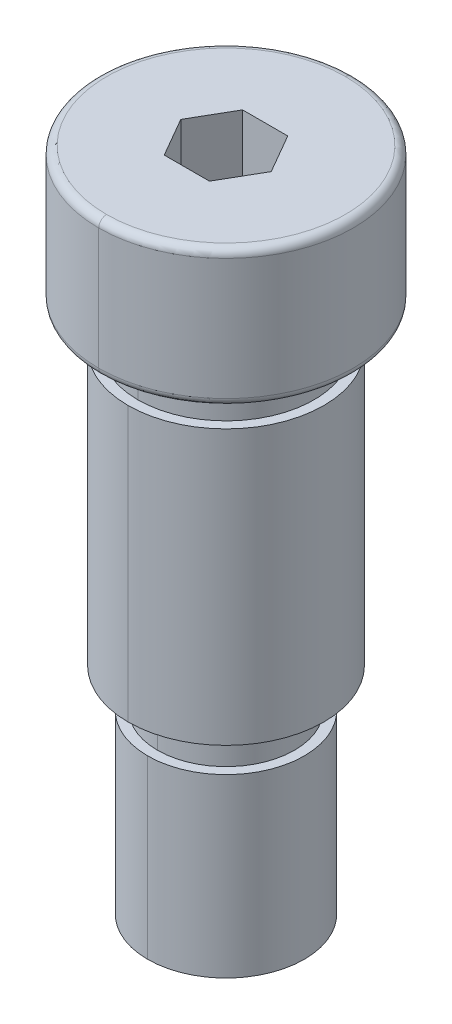
ISO-10303-21;
HEADER;
FILE_DESCRIPTION(('STEP AP214'),'2;1');
FILE_NAME('part.step','',(''),(''),'','','');
FILE_SCHEMA(('AUTOMOTIVE_DESIGN { 1 0 10303 214 1 1 1 1 }'));
ENDSEC;
DATA;
#1=APPLICATION_CONTEXT('core data for automotive mechanical design processes');
#2=APPLICATION_PROTOCOL_DEFINITION('international standard','automotive_design',2000,#1);
#3=PRODUCT_CONTEXT('',#1,'mechanical');
#4=PRODUCT('Part','Part','',(#3));
#5=PRODUCT_RELATED_PRODUCT_CATEGORY('part','',(#4));
#6=PRODUCT_DEFINITION_FORMATION('','',#4);
#7=PRODUCT_DEFINITION_CONTEXT('part definition',#1,'design');
#8=PRODUCT_DEFINITION('design','',#6,#7);
#9=PRODUCT_DEFINITION_SHAPE('','',#8);
#10=(LENGTH_UNIT() NAMED_UNIT(*) SI_UNIT(.MILLI.,.METRE.));
#11=(NAMED_UNIT(*) PLANE_ANGLE_UNIT() SI_UNIT($,.RADIAN.));
#12=(NAMED_UNIT(*) SI_UNIT($,.STERADIAN.) SOLID_ANGLE_UNIT());
#13=UNCERTAINTY_MEASURE_WITH_UNIT(LENGTH_MEASURE(1.E-05),#10,'distance_accuracy_value','');
#14=(GEOMETRIC_REPRESENTATION_CONTEXT(3) GLOBAL_UNCERTAINTY_ASSIGNED_CONTEXT((#13)) GLOBAL_UNIT_ASSIGNED_CONTEXT((#10,
#11,#12)) REPRESENTATION_CONTEXT('',''));
#15=CARTESIAN_POINT('',(0.,0.,0.));
#16=DIRECTION('',(0.,0.,1.));
#17=DIRECTION('',(1.,0.,0.));
#18=AXIS2_PLACEMENT_3D('',#15,#16,#17);
#19=CARTESIAN_POINT('',(0.,0.,0.));
#20=DIRECTION('',(0.,-1.,0.));
#21=DIRECTION('',(0.,0.,-1.));
#22=AXIS2_PLACEMENT_3D('',#19,#20,#21);
#23=CYLINDRICAL_SURFACE('',#22,4.);
#24=CARTESIAN_POINT('',(0.,9.,0.));
#25=DIRECTION('',(0.,-1.,0.));
#26=DIRECTION('',(0.,0.,-1.));
#27=AXIS2_PLACEMENT_3D('',#24,#25,#26);
#28=CIRCLE('',#27,4.);
#29=CARTESIAN_POINT('',(0.,9.,-4.));
#30=VERTEX_POINT('',#29);
#31=CARTESIAN_POINT('',(0.,9.,4.));
#32=VERTEX_POINT('',#31);
#33=EDGE_CURVE('E11',#30,#32,#28,.T.);
#34=ORIENTED_EDGE('',*,*,#33,.T.);
#35=DIRECTION('',(0.,-1.,0.));
#36=VECTOR('',#35,1.);
#37=CARTESIAN_POINT('',(0.,0.,4.));
#38=LINE('',#37,#36);
#39=CARTESIAN_POINT('',(0.,0.,4.));
#40=VERTEX_POINT('',#39);
#41=EDGE_CURVE('E28',#32,#40,#38,.T.);
#42=ORIENTED_EDGE('',*,*,#41,.T.);
#43=CARTESIAN_POINT('',(0.,0.,0.));
#44=DIRECTION('',(0.,-1.,0.));
#45=DIRECTION('',(0.,0.,-1.));
#46=AXIS2_PLACEMENT_3D('',#43,#44,#45);
#47=CIRCLE('',#46,4.);
#48=CARTESIAN_POINT('',(0.,0.,-4.));
#49=VERTEX_POINT('',#48);
#50=EDGE_CURVE('E242',#49,#40,#47,.T.);
#51=ORIENTED_EDGE('',*,*,#50,.F.);
#52=DIRECTION('',(0.,-1.,0.));
#53=VECTOR('',#52,1.);
#54=CARTESIAN_POINT('',(0.,0.,-4.));
#55=LINE('',#54,#53);
#56=EDGE_CURVE('E315',#30,#49,#55,.T.);
#57=ORIENTED_EDGE('',*,*,#56,.F.);
#58=EDGE_LOOP('',(#34,#42,#51,#57));
#59=FACE_BOUND('',#58,.T.);
#60=ADVANCED_FACE('F17',(#59),#23,.T.);
#61=CARTESIAN_POINT('',(0.,0.,0.));
#62=DIRECTION('',(0.,-1.,0.));
#63=DIRECTION('',(0.,0.,-1.));
#64=AXIS2_PLACEMENT_3D('',#61,#62,#63);
#65=CYLINDRICAL_SURFACE('',#64,3.5);
#66=CARTESIAN_POINT('',(0.,11.,0.));
#67=DIRECTION('',(0.,-1.,0.));
#68=DIRECTION('',(0.,0.,-1.));
#69=AXIS2_PLACEMENT_3D('',#66,#67,#68);
#70=CIRCLE('',#69,3.5);
#71=CARTESIAN_POINT('',(0.,11.,-3.5));
#72=VERTEX_POINT('',#71);
#73=CARTESIAN_POINT('',(0.,11.,3.5));
#74=VERTEX_POINT('',#73);
#75=EDGE_CURVE('E178',#72,#74,#70,.T.);
#76=ORIENTED_EDGE('',*,*,#75,.T.);
#77=DIRECTION('',(0.,-1.,0.));
#78=VECTOR('',#77,1.);
#79=CARTESIAN_POINT('',(0.,0.,3.5));
#80=LINE('',#79,#78);
#81=CARTESIAN_POINT('',(0.,9.,3.5));
#82=VERTEX_POINT('',#81);
#83=EDGE_CURVE('E167',#74,#82,#80,.T.);
#84=ORIENTED_EDGE('',*,*,#83,.T.);
#85=CARTESIAN_POINT('',(0.,9.,0.));
#86=DIRECTION('',(0.,-1.,0.));
#87=DIRECTION('',(0.,0.,-1.));
#88=AXIS2_PLACEMENT_3D('',#85,#86,#87);
#89=CIRCLE('',#88,3.5);
#90=CARTESIAN_POINT('',(0.,9.,-3.5));
#91=VERTEX_POINT('',#90);
#92=EDGE_CURVE('E201',#91,#82,#89,.T.);
#93=ORIENTED_EDGE('',*,*,#92,.F.);
#94=DIRECTION('',(0.,-1.,0.));
#95=VECTOR('',#94,1.);
#96=CARTESIAN_POINT('',(0.,0.,-3.5));
#97=LINE('',#96,#95);
#98=EDGE_CURVE('E184',#72,#91,#97,.T.);
#99=ORIENTED_EDGE('',*,*,#98,.F.);
#100=EDGE_LOOP('',(#76,#84,#93,#99));
#101=FACE_BOUND('',#100,.T.);
#102=ADVANCED_FACE('F183',(#101),#65,.T.);
#103=CARTESIAN_POINT('',(0.,0.,0.));
#104=DIRECTION('',(0.,-1.,0.));
#105=DIRECTION('',(0.,0.,-1.));
#106=AXIS2_PLACEMENT_3D('',#103,#104,#105);
#107=CYLINDRICAL_SURFACE('',#106,5.);
#108=CARTESIAN_POINT('',(0.,25.,0.));
#109=DIRECTION('',(0.,-1.,0.));
#110=DIRECTION('',(0.,0.,-1.));
#111=AXIS2_PLACEMENT_3D('',#108,#109,#110);
#112=CIRCLE('',#111,5.);
#113=CARTESIAN_POINT('',(0.,25.,-5.));
#114=VERTEX_POINT('',#113);
#115=CARTESIAN_POINT('',(0.,25.,5.));
#116=VERTEX_POINT('',#115);
#117=EDGE_CURVE('E179',#114,#116,#112,.T.);
#118=ORIENTED_EDGE('',*,*,#117,.T.);
#119=DIRECTION('',(0.,-1.,0.));
#120=VECTOR('',#119,1.);
#121=CARTESIAN_POINT('',(0.,0.,5.));
#122=LINE('',#121,#120);
#123=CARTESIAN_POINT('',(0.,11.,5.));
#124=VERTEX_POINT('',#123);
#125=EDGE_CURVE('E248',#116,#124,#122,.T.);
#126=ORIENTED_EDGE('',*,*,#125,.T.);
#127=CARTESIAN_POINT('',(0.,11.,0.));
#128=DIRECTION('',(0.,-1.,0.));
#129=DIRECTION('',(0.,0.,-1.));
#130=AXIS2_PLACEMENT_3D('',#127,#128,#129);
#131=CIRCLE('',#130,5.);
#132=CARTESIAN_POINT('',(0.,11.,-5.));
#133=VERTEX_POINT('',#132);
#134=EDGE_CURVE('E198',#133,#124,#131,.T.);
#135=ORIENTED_EDGE('',*,*,#134,.F.);
#136=DIRECTION('',(0.,-1.,0.));
#137=VECTOR('',#136,1.);
#138=CARTESIAN_POINT('',(0.,0.,-5.));
#139=LINE('',#138,#137);
#140=EDGE_CURVE('E220',#114,#133,#139,.T.);
#141=ORIENTED_EDGE('',*,*,#140,.F.);
#142=EDGE_LOOP('',(#118,#126,#135,#141));
#143=FACE_BOUND('',#142,.T.);
#144=ADVANCED_FACE('F482',(#143),#107,.T.);
#145=CARTESIAN_POINT('',(0.,0.,0.));
#146=DIRECTION('',(0.,-1.,0.));
#147=DIRECTION('',(0.,0.,-1.));
#148=AXIS2_PLACEMENT_3D('',#145,#146,#147);
#149=CYLINDRICAL_SURFACE('',#148,4.5);
#150=CARTESIAN_POINT('',(0.,27.,0.));
#151=DIRECTION('',(0.,-1.,0.));
#152=DIRECTION('',(0.,0.,-1.));
#153=AXIS2_PLACEMENT_3D('',#150,#151,#152);
#154=CIRCLE('',#153,4.5);
#155=CARTESIAN_POINT('',(0.,27.,-4.5));
#156=VERTEX_POINT('',#155);
#157=CARTESIAN_POINT('',(0.,27.,4.5));
#158=VERTEX_POINT('',#157);
#159=EDGE_CURVE('E205',#156,#158,#154,.T.);
#160=ORIENTED_EDGE('',*,*,#159,.T.);
#161=DIRECTION('',(0.,-1.,0.));
#162=VECTOR('',#161,1.);
#163=CARTESIAN_POINT('',(0.,0.,4.5));
#164=LINE('',#163,#162);
#165=CARTESIAN_POINT('',(0.,25.,4.5));
#166=VERTEX_POINT('',#165);
#167=EDGE_CURVE('E207',#158,#166,#164,.T.);
#168=ORIENTED_EDGE('',*,*,#167,.T.);
#169=CARTESIAN_POINT('',(0.,25.,0.));
#170=DIRECTION('',(0.,-1.,0.));
#171=DIRECTION('',(0.,0.,-1.));
#172=AXIS2_PLACEMENT_3D('',#169,#170,#171);
#173=CIRCLE('',#172,4.5);
#174=CARTESIAN_POINT('',(0.,25.,-4.5));
#175=VERTEX_POINT('',#174);
#176=EDGE_CURVE('E265',#175,#166,#173,.T.);
#177=ORIENTED_EDGE('',*,*,#176,.F.);
#178=DIRECTION('',(0.,-1.,0.));
#179=VECTOR('',#178,1.);
#180=CARTESIAN_POINT('',(0.,0.,-4.5));
#181=LINE('',#180,#179);
#182=EDGE_CURVE('E267',#156,#175,#181,.T.);
#183=ORIENTED_EDGE('',*,*,#182,.F.);
#184=EDGE_LOOP('',(#160,#168,#177,#183));
#185=FACE_BOUND('',#184,.T.);
#186=ADVANCED_FACE('F457',(#185),#149,.T.);
#187=CARTESIAN_POINT('',(0.,27.4,0.));
#188=DIRECTION('',(0.,-1.,0.));
#189=DIRECTION('',(0.,0.,-1.));
#190=AXIS2_PLACEMENT_3D('',#187,#188,#189);
#191=TOROIDAL_SURFACE('',#190,6.1,0.4);
#192=CARTESIAN_POINT('',(0.,27.4,0.));
#193=DIRECTION('',(0.,-1.,0.));
#194=DIRECTION('',(0.,0.,-1.));
#195=AXIS2_PLACEMENT_3D('',#192,#193,#194);
#196=CIRCLE('',#195,6.5);
#197=CARTESIAN_POINT('',(0.,27.4,-6.5));
#198=VERTEX_POINT('',#197);
#199=CARTESIAN_POINT('',(0.,27.4,6.5));
#200=VERTEX_POINT('',#199);
#201=EDGE_CURVE('E210',#198,#200,#196,.T.);
#202=ORIENTED_EDGE('',*,*,#201,.T.);
#203=CARTESIAN_POINT('',(0.,27.4,6.1));
#204=DIRECTION('',(1.,0.,0.));
#205=DIRECTION('',(0.,0.,-1.));
#206=AXIS2_PLACEMENT_3D('',#203,#204,#205);
#207=CIRCLE('',#206,0.4);
#208=CARTESIAN_POINT('',(0.,27.,6.1));
#209=VERTEX_POINT('',#208);
#210=EDGE_CURVE('E255',#200,#209,#207,.T.);
#211=ORIENTED_EDGE('',*,*,#210,.T.);
#212=CARTESIAN_POINT('',(0.,27.,0.));
#213=DIRECTION('',(0.,-1.,0.));
#214=DIRECTION('',(0.,0.,-1.));
#215=AXIS2_PLACEMENT_3D('',#212,#213,#214);
#216=CIRCLE('',#215,6.1);
#217=CARTESIAN_POINT('',(0.,27.,-6.1));
#218=VERTEX_POINT('',#217);
#219=EDGE_CURVE('E310',#218,#209,#216,.T.);
#220=ORIENTED_EDGE('',*,*,#219,.F.);
#221=CARTESIAN_POINT('',(0.,27.4,-6.1));
#222=DIRECTION('',(-1.,0.,0.));
#223=DIRECTION('',(0.,0.,1.));
#224=AXIS2_PLACEMENT_3D('',#221,#222,#223);
#225=CIRCLE('',#224,0.4);
#226=EDGE_CURVE('E262',#198,#218,#225,.T.);
#227=ORIENTED_EDGE('',*,*,#226,.F.);
#228=EDGE_LOOP('',(#202,#211,#220,#227));
#229=FACE_BOUND('',#228,.T.);
#230=ADVANCED_FACE('F585',(#229),#191,.T.);
#231=CARTESIAN_POINT('',(0.,0.,0.));
#232=DIRECTION('',(0.,-1.,0.));
#233=DIRECTION('',(0.,0.,-1.));
#234=AXIS2_PLACEMENT_3D('',#231,#232,#233);
#235=CYLINDRICAL_SURFACE('',#234,6.5);
#236=CARTESIAN_POINT('',(0.,33.6,0.));
#237=DIRECTION('',(0.,-1.,0.));
#238=DIRECTION('',(0.,0.,-1.));
#239=AXIS2_PLACEMENT_3D('',#236,#237,#238);
#240=CIRCLE('',#239,6.5);
#241=CARTESIAN_POINT('',(0.,33.6,-6.5));
#242=VERTEX_POINT('',#241);
#243=CARTESIAN_POINT('',(0.,33.6,6.5));
#244=VERTEX_POINT('',#243);
#245=EDGE_CURVE('E251',#242,#244,#240,.T.);
#246=ORIENTED_EDGE('',*,*,#245,.T.);
#247=DIRECTION('',(0.,-1.,0.));
#248=VECTOR('',#247,1.);
#249=CARTESIAN_POINT('',(0.,0.,6.5));
#250=LINE('',#249,#248);
#251=EDGE_CURVE('E256',#244,#200,#250,.T.);
#252=ORIENTED_EDGE('',*,*,#251,.T.);
#253=ORIENTED_EDGE('',*,*,#201,.F.);
#254=DIRECTION('',(0.,-1.,0.));
#255=VECTOR('',#254,1.);
#256=CARTESIAN_POINT('',(0.,0.,-6.5));
#257=LINE('',#256,#255);
#258=EDGE_CURVE('E261',#242,#198,#257,.T.);
#259=ORIENTED_EDGE('',*,*,#258,.F.);
#260=EDGE_LOOP('',(#246,#252,#253,#259));
#261=FACE_BOUND('',#260,.T.);
#262=ADVANCED_FACE('F486',(#261),#235,.T.);
#263=CARTESIAN_POINT('',(0.,33.6,0.));
#264=DIRECTION('',(0.,-1.,0.));
#265=DIRECTION('',(0.,0.,-1.));
#266=AXIS2_PLACEMENT_3D('',#263,#264,#265);
#267=TOROIDAL_SURFACE('',#266,6.1,0.4);
#268=CARTESIAN_POINT('',(0.,34.,0.));
#269=DIRECTION('',(0.,-1.,0.));
#270=DIRECTION('',(0.,0.,-1.));
#271=AXIS2_PLACEMENT_3D('',#268,#269,#270);
#272=CIRCLE('',#271,6.1);
#273=CARTESIAN_POINT('',(0.,34.,-6.1));
#274=VERTEX_POINT('',#273);
#275=CARTESIAN_POINT('',(0.,34.,6.1));
#276=VERTEX_POINT('',#275);
#277=EDGE_CURVE('E277',#274,#276,#272,.T.);
#278=ORIENTED_EDGE('',*,*,#277,.T.);
#279=CARTESIAN_POINT('',(0.,33.6,6.1));
#280=DIRECTION('',(1.,0.,0.));
#281=DIRECTION('',(0.,0.,-1.));
#282=AXIS2_PLACEMENT_3D('',#279,#280,#281);
#283=CIRCLE('',#282,0.4);
#284=EDGE_CURVE('E218',#276,#244,#283,.T.);
#285=ORIENTED_EDGE('',*,*,#284,.T.);
#286=ORIENTED_EDGE('',*,*,#245,.F.);
#287=CARTESIAN_POINT('',(0.,33.6,-6.1));
#288=DIRECTION('',(-1.,0.,0.));
#289=DIRECTION('',(0.,0.,1.));
#290=AXIS2_PLACEMENT_3D('',#287,#288,#289);
#291=CIRCLE('',#290,0.4);
#292=EDGE_CURVE('E219',#274,#242,#291,.T.);
#293=ORIENTED_EDGE('',*,*,#292,.F.);
#294=EDGE_LOOP('',(#278,#285,#286,#293));
#295=FACE_BOUND('',#294,.T.);
#296=ADVANCED_FACE('F639',(#295),#267,.T.);
#297=CARTESIAN_POINT('',(0.,34.,0.));
#298=DIRECTION('',(0.,-1.,0.));
#299=DIRECTION('',(0.,0.,-1.));
#300=AXIS2_PLACEMENT_3D('',#297,#298,#299);
#301=PLANE('',#300);
#302=ORIENTED_EDGE('',*,*,#277,.F.);
#303=CARTESIAN_POINT('',(0.,34.,0.));
#304=DIRECTION('',(0.,-1.,0.));
#305=DIRECTION('',(0.,0.,-1.));
#306=AXIS2_PLACEMENT_3D('',#303,#304,#305);
#307=CIRCLE('',#306,6.1);
#308=EDGE_CURVE('E215',#276,#274,#307,.T.);
#309=ORIENTED_EDGE('',*,*,#308,.F.);
#310=EDGE_LOOP('',(#302,#309));
#311=FACE_BOUND('',#310,.T.);
#312=DIRECTION('',(-1.,0.,0.));
#313=VECTOR('',#312,1.);
#314=CARTESIAN_POINT('',(1.15470053837925,34.,-2.));
#315=LINE('',#314,#313);
#316=CARTESIAN_POINT('',(1.15470053837925,34.,-2.));
#317=VERTEX_POINT('',#316);
#318=CARTESIAN_POINT('',(-1.15470053837925,34.,-2.));
#319=VERTEX_POINT('',#318);
#320=EDGE_CURVE('E332',#317,#319,#315,.T.);
#321=ORIENTED_EDGE('',*,*,#320,.F.);
#322=DIRECTION('',(-0.5,0.,-0.866025403784439));
#323=VECTOR('',#322,1.);
#324=CARTESIAN_POINT('',(2.30940107675851,34.,0.));
#325=LINE('',#324,#323);
#326=CARTESIAN_POINT('',(2.30940107675851,34.,0.));
#327=VERTEX_POINT('',#326);
#328=EDGE_CURVE('E269',#327,#317,#325,.T.);
#329=ORIENTED_EDGE('',*,*,#328,.F.);
#330=DIRECTION('',(0.5,0.,-0.866025403784439));
#331=VECTOR('',#330,1.);
#332=CARTESIAN_POINT('',(1.15470053837925,34.,2.));
#333=LINE('',#332,#331);
#334=CARTESIAN_POINT('',(1.15470053837925,34.,2.));
#335=VERTEX_POINT('',#334);
#336=EDGE_CURVE('E71',#335,#327,#333,.T.);
#337=ORIENTED_EDGE('',*,*,#336,.F.);
#338=DIRECTION('',(1.,0.,0.));
#339=VECTOR('',#338,1.);
#340=CARTESIAN_POINT('',(-1.15470053837925,34.,2.));
#341=LINE('',#340,#339);
#342=CARTESIAN_POINT('',(-1.15470053837925,34.,2.));
#343=VERTEX_POINT('',#342);
#344=EDGE_CURVE('E87',#343,#335,#341,.T.);
#345=ORIENTED_EDGE('',*,*,#344,.F.);
#346=DIRECTION('',(0.5,0.,0.866025403784439));
#347=VECTOR('',#346,1.);
#348=CARTESIAN_POINT('',(-2.30940107675851,34.,0.));
#349=LINE('',#348,#347);
#350=CARTESIAN_POINT('',(-2.30940107675851,34.,0.));
#351=VERTEX_POINT('',#350);
#352=EDGE_CURVE('E385',#351,#343,#349,.T.);
#353=ORIENTED_EDGE('',*,*,#352,.F.);
#354=DIRECTION('',(-0.5,0.,0.866025403784439));
#355=VECTOR('',#354,1.);
#356=CARTESIAN_POINT('',(-1.15470053837925,34.,-2.));
#357=LINE('',#356,#355);
#358=EDGE_CURVE('E378',#319,#351,#357,.T.);
#359=ORIENTED_EDGE('',*,*,#358,.F.);
#360=EDGE_LOOP('',(#321,#329,#337,#345,#353,#359));
#361=FACE_BOUND('',#360,.T.);
#362=ADVANCED_FACE('F417',(#311,#361),#301,.F.);
#363=CARTESIAN_POINT('',(0.,33.6,0.));
#364=DIRECTION('',(0.,-1.,0.));
#365=DIRECTION('',(0.,0.,-1.));
#366=AXIS2_PLACEMENT_3D('',#363,#364,#365);
#367=TOROIDAL_SURFACE('',#366,6.1,0.4);
#368=ORIENTED_EDGE('',*,*,#284,.F.);
#369=ORIENTED_EDGE('',*,*,#308,.T.);
#370=ORIENTED_EDGE('',*,*,#292,.T.);
#371=CARTESIAN_POINT('',(0.,33.6,0.));
#372=DIRECTION('',(0.,-1.,0.));
#373=DIRECTION('',(0.,0.,-1.));
#374=AXIS2_PLACEMENT_3D('',#371,#372,#373);
#375=CIRCLE('',#374,6.5);
#376=EDGE_CURVE('E356',#244,#242,#375,.T.);
#377=ORIENTED_EDGE('',*,*,#376,.F.);
#378=EDGE_LOOP('',(#368,#369,#370,#377));
#379=FACE_BOUND('',#378,.T.);
#380=ADVANCED_FACE('F493',(#379),#367,.T.);
#381=CARTESIAN_POINT('',(0.,0.,0.));
#382=DIRECTION('',(0.,-1.,0.));
#383=DIRECTION('',(0.,0.,-1.));
#384=AXIS2_PLACEMENT_3D('',#381,#382,#383);
#385=CYLINDRICAL_SURFACE('',#384,6.5);
#386=ORIENTED_EDGE('',*,*,#251,.F.);
#387=ORIENTED_EDGE('',*,*,#376,.T.);
#388=ORIENTED_EDGE('',*,*,#258,.T.);
#389=CARTESIAN_POINT('',(0.,27.4,0.));
#390=DIRECTION('',(0.,-1.,0.));
#391=DIRECTION('',(0.,0.,-1.));
#392=AXIS2_PLACEMENT_3D('',#389,#390,#391);
#393=CIRCLE('',#392,6.5);
#394=EDGE_CURVE('E257',#200,#198,#393,.T.);
#395=ORIENTED_EDGE('',*,*,#394,.F.);
#396=EDGE_LOOP('',(#386,#387,#388,#395));
#397=FACE_BOUND('',#396,.T.);
#398=ADVANCED_FACE('F471',(#397),#385,.T.);
#399=CARTESIAN_POINT('',(0.,27.4,0.));
#400=DIRECTION('',(0.,-1.,0.));
#401=DIRECTION('',(0.,0.,-1.));
#402=AXIS2_PLACEMENT_3D('',#399,#400,#401);
#403=TOROIDAL_SURFACE('',#402,6.1,0.4);
#404=ORIENTED_EDGE('',*,*,#210,.F.);
#405=ORIENTED_EDGE('',*,*,#394,.T.);
#406=ORIENTED_EDGE('',*,*,#226,.T.);
#407=CARTESIAN_POINT('',(0.,27.,0.));
#408=DIRECTION('',(0.,-1.,0.));
#409=DIRECTION('',(0.,0.,-1.));
#410=AXIS2_PLACEMENT_3D('',#407,#408,#409);
#411=CIRCLE('',#410,6.1);
#412=EDGE_CURVE('E287',#209,#218,#411,.T.);
#413=ORIENTED_EDGE('',*,*,#412,.F.);
#414=EDGE_LOOP('',(#404,#405,#406,#413));
#415=FACE_BOUND('',#414,.T.);
#416=ADVANCED_FACE('F461',(#415),#403,.T.);
#417=CARTESIAN_POINT('',(-6.1,27.,0.));
#418=DIRECTION('',(0.,1.,0.));
#419=DIRECTION('',(1.,0.,0.));
#420=AXIS2_PLACEMENT_3D('',#417,#418,#419);
#421=PLANE('',#420);
#422=ORIENTED_EDGE('',*,*,#219,.T.);
#423=ORIENTED_EDGE('',*,*,#412,.T.);
#424=EDGE_LOOP('',(#422,#423));
#425=FACE_BOUND('',#424,.T.);
#426=ORIENTED_EDGE('',*,*,#159,.F.);
#427=CARTESIAN_POINT('',(0.,27.,0.));
#428=DIRECTION('',(0.,-1.,0.));
#429=DIRECTION('',(0.,0.,-1.));
#430=AXIS2_PLACEMENT_3D('',#427,#428,#429);
#431=CIRCLE('',#430,4.5);
#432=EDGE_CURVE('E284',#158,#156,#431,.T.);
#433=ORIENTED_EDGE('',*,*,#432,.F.);
#434=EDGE_LOOP('',(#426,#433));
#435=FACE_BOUND('',#434,.T.);
#436=ADVANCED_FACE('F459',(#425,#435),#421,.F.);
#437=CARTESIAN_POINT('',(0.,0.,0.));
#438=DIRECTION('',(0.,-1.,0.));
#439=DIRECTION('',(0.,0.,-1.));
#440=AXIS2_PLACEMENT_3D('',#437,#438,#439);
#441=CYLINDRICAL_SURFACE('',#440,4.5);
#442=ORIENTED_EDGE('',*,*,#167,.F.);
#443=ORIENTED_EDGE('',*,*,#432,.T.);
#444=ORIENTED_EDGE('',*,*,#182,.T.);
#445=CARTESIAN_POINT('',(0.,25.,0.));
#446=DIRECTION('',(0.,-1.,0.));
#447=DIRECTION('',(0.,0.,-1.));
#448=AXIS2_PLACEMENT_3D('',#445,#446,#447);
#449=CIRCLE('',#448,4.5);
#450=EDGE_CURVE('E232',#166,#175,#449,.T.);
#451=ORIENTED_EDGE('',*,*,#450,.F.);
#452=EDGE_LOOP('',(#442,#443,#444,#451));
#453=FACE_BOUND('',#452,.T.);
#454=ADVANCED_FACE('F453',(#453),#441,.T.);
#455=CARTESIAN_POINT('',(-4.5,25.,0.));
#456=DIRECTION('',(0.,-1.,0.));
#457=DIRECTION('',(0.,0.,-1.));
#458=AXIS2_PLACEMENT_3D('',#455,#456,#457);
#459=PLANE('',#458);
#460=ORIENTED_EDGE('',*,*,#117,.F.);
#461=CARTESIAN_POINT('',(0.,25.,0.));
#462=DIRECTION('',(0.,-1.,0.));
#463=DIRECTION('',(0.,0.,-1.));
#464=AXIS2_PLACEMENT_3D('',#461,#462,#463);
#465=CIRCLE('',#464,5.);
#466=EDGE_CURVE('E223',#116,#114,#465,.T.);
#467=ORIENTED_EDGE('',*,*,#466,.F.);
#468=EDGE_LOOP('',(#460,#467));
#469=FACE_BOUND('',#468,.T.);
#470=ORIENTED_EDGE('',*,*,#176,.T.);
#471=ORIENTED_EDGE('',*,*,#450,.T.);
#472=EDGE_LOOP('',(#470,#471));
#473=FACE_BOUND('',#472,.T.);
#474=ADVANCED_FACE('F469',(#469,#473),#459,.F.);
#475=CARTESIAN_POINT('',(0.,0.,0.));
#476=DIRECTION('',(0.,-1.,0.));
#477=DIRECTION('',(0.,0.,-1.));
#478=AXIS2_PLACEMENT_3D('',#475,#476,#477);
#479=CYLINDRICAL_SURFACE('',#478,5.);
#480=ORIENTED_EDGE('',*,*,#125,.F.);
#481=ORIENTED_EDGE('',*,*,#466,.T.);
#482=ORIENTED_EDGE('',*,*,#140,.T.);
#483=CARTESIAN_POINT('',(0.,11.,0.));
#484=DIRECTION('',(0.,-1.,0.));
#485=DIRECTION('',(0.,0.,-1.));
#486=AXIS2_PLACEMENT_3D('',#483,#484,#485);
#487=CIRCLE('',#486,5.);
#488=EDGE_CURVE('E190',#124,#133,#487,.T.);
#489=ORIENTED_EDGE('',*,*,#488,.F.);
#490=EDGE_LOOP('',(#480,#481,#482,#489));
#491=FACE_BOUND('',#490,.T.);
#492=ADVANCED_FACE('F602',(#491),#479,.T.);
#493=CARTESIAN_POINT('',(-5.,11.,0.));
#494=DIRECTION('',(0.,1.,0.));
#495=DIRECTION('',(1.,0.,0.));
#496=AXIS2_PLACEMENT_3D('',#493,#494,#495);
#497=PLANE('',#496);
#498=ORIENTED_EDGE('',*,*,#134,.T.);
#499=ORIENTED_EDGE('',*,*,#488,.T.);
#500=EDGE_LOOP('',(#498,#499));
#501=FACE_BOUND('',#500,.T.);
#502=ORIENTED_EDGE('',*,*,#75,.F.);
#503=CARTESIAN_POINT('',(0.,11.,0.));
#504=DIRECTION('',(0.,-1.,0.));
#505=DIRECTION('',(0.,0.,-1.));
#506=AXIS2_PLACEMENT_3D('',#503,#504,#505);
#507=CIRCLE('',#506,3.5);
#508=EDGE_CURVE('E172',#74,#72,#507,.T.);
#509=ORIENTED_EDGE('',*,*,#508,.F.);
#510=EDGE_LOOP('',(#502,#509));
#511=FACE_BOUND('',#510,.T.);
#512=ADVANCED_FACE('F188',(#501,#511),#497,.F.);
#513=CARTESIAN_POINT('',(0.,0.,0.));
#514=DIRECTION('',(0.,-1.,0.));
#515=DIRECTION('',(0.,0.,-1.));
#516=AXIS2_PLACEMENT_3D('',#513,#514,#515);
#517=CYLINDRICAL_SURFACE('',#516,3.5);
#518=ORIENTED_EDGE('',*,*,#83,.F.);
#519=ORIENTED_EDGE('',*,*,#508,.T.);
#520=ORIENTED_EDGE('',*,*,#98,.T.);
#521=CARTESIAN_POINT('',(0.,9.,0.));
#522=DIRECTION('',(0.,-1.,0.));
#523=DIRECTION('',(0.,0.,-1.));
#524=AXIS2_PLACEMENT_3D('',#521,#522,#523);
#525=CIRCLE('',#524,3.5);
#526=EDGE_CURVE('E174',#82,#91,#525,.T.);
#527=ORIENTED_EDGE('',*,*,#526,.F.);
#528=EDGE_LOOP('',(#518,#519,#520,#527));
#529=FACE_BOUND('',#528,.T.);
#530=ADVANCED_FACE('F169',(#529),#517,.T.);
#531=CARTESIAN_POINT('',(-3.5,9.,0.));
#532=DIRECTION('',(0.,-1.,0.));
#533=DIRECTION('',(0.,0.,-1.));
#534=AXIS2_PLACEMENT_3D('',#531,#532,#533);
#535=PLANE('',#534);
#536=ORIENTED_EDGE('',*,*,#33,.F.);
#537=CARTESIAN_POINT('',(0.,9.,0.));
#538=DIRECTION('',(0.,-1.,0.));
#539=DIRECTION('',(0.,0.,-1.));
#540=AXIS2_PLACEMENT_3D('',#537,#538,#539);
#541=CIRCLE('',#540,4.);
#542=EDGE_CURVE('E312',#32,#30,#541,.T.);
#543=ORIENTED_EDGE('',*,*,#542,.F.);
#544=EDGE_LOOP('',(#536,#543));
#545=FACE_BOUND('',#544,.T.);
#546=ORIENTED_EDGE('',*,*,#92,.T.);
#547=ORIENTED_EDGE('',*,*,#526,.T.);
#548=EDGE_LOOP('',(#546,#547));
#549=FACE_BOUND('',#548,.T.);
#550=ADVANCED_FACE('F500',(#545,#549),#535,.F.);
#551=CARTESIAN_POINT('',(0.,0.,0.));
#552=DIRECTION('',(0.,-1.,0.));
#553=DIRECTION('',(0.,0.,-1.));
#554=AXIS2_PLACEMENT_3D('',#551,#552,#553);
#555=CYLINDRICAL_SURFACE('',#554,4.);
#556=ORIENTED_EDGE('',*,*,#41,.F.);
#557=ORIENTED_EDGE('',*,*,#542,.T.);
#558=ORIENTED_EDGE('',*,*,#56,.T.);
#559=CARTESIAN_POINT('',(0.,0.,0.));
#560=DIRECTION('',(0.,-1.,0.));
#561=DIRECTION('',(0.,0.,-1.));
#562=AXIS2_PLACEMENT_3D('',#559,#560,#561);
#563=CIRCLE('',#562,4.);
#564=EDGE_CURVE('E272',#40,#49,#563,.T.);
#565=ORIENTED_EDGE('',*,*,#564,.F.);
#566=EDGE_LOOP('',(#556,#557,#558,#565));
#567=FACE_BOUND('',#566,.T.);
#568=ADVANCED_FACE('F19',(#567),#555,.T.);
#569=CARTESIAN_POINT('',(-4.,0.,0.));
#570=DIRECTION('',(0.,1.,0.));
#571=DIRECTION('',(1.,0.,0.));
#572=AXIS2_PLACEMENT_3D('',#569,#570,#571);
#573=PLANE('',#572);
#574=ORIENTED_EDGE('',*,*,#50,.T.);
#575=ORIENTED_EDGE('',*,*,#564,.T.);
#576=EDGE_LOOP('',(#574,#575));
#577=FACE_BOUND('',#576,.T.);
#578=ADVANCED_FACE('F507',(#577),#573,.F.);
#579=CARTESIAN_POINT('',(2.30940107675851,30.5,0.));
#580=DIRECTION('',(0.866025403784439,0.,-0.5));
#581=DIRECTION('',(0.,-1.,0.));
#582=AXIS2_PLACEMENT_3D('',#579,#580,#581);
#583=PLANE('',#582);
#584=ORIENTED_EDGE('',*,*,#328,.T.);
#585=DIRECTION('',(0.,1.,0.));
#586=VECTOR('',#585,1.);
#587=CARTESIAN_POINT('',(1.15470053837925,30.5,-2.));
#588=LINE('',#587,#586);
#589=CARTESIAN_POINT('',(1.15470053837925,30.5,-2.));
#590=VERTEX_POINT('',#589);
#591=EDGE_CURVE('E282',#590,#317,#588,.T.);
#592=ORIENTED_EDGE('',*,*,#591,.F.);
#593=DIRECTION('',(-0.5,0.,-0.866025403784439));
#594=VECTOR('',#593,1.);
#595=CARTESIAN_POINT('',(2.30940107675851,30.5,0.));
#596=LINE('',#595,#594);
#597=CARTESIAN_POINT('',(2.30940107675851,30.5,0.));
#598=VERTEX_POINT('',#597);
#599=EDGE_CURVE('E278',#598,#590,#596,.T.);
#600=ORIENTED_EDGE('',*,*,#599,.F.);
#601=DIRECTION('',(0.,1.,0.));
#602=VECTOR('',#601,1.);
#603=CARTESIAN_POINT('',(2.30940107675851,30.5,0.));
#604=LINE('',#603,#602);
#605=EDGE_CURVE('E273',#598,#327,#604,.T.);
#606=ORIENTED_EDGE('',*,*,#605,.T.);
#607=EDGE_LOOP('',(#584,#592,#600,#606));
#608=FACE_BOUND('',#607,.T.);
#609=ADVANCED_FACE('F420',(#608),#583,.F.);
#610=CARTESIAN_POINT('',(1.15470053837925,30.5,2.));
#611=DIRECTION('',(0.866025403784439,0.,0.5));
#612=DIRECTION('',(0.,-1.,0.));
#613=AXIS2_PLACEMENT_3D('',#610,#611,#612);
#614=PLANE('',#613);
#615=ORIENTED_EDGE('',*,*,#336,.T.);
#616=ORIENTED_EDGE('',*,*,#605,.F.);
#617=DIRECTION('',(0.5,0.,-0.866025403784439));
#618=VECTOR('',#617,1.);
#619=CARTESIAN_POINT('',(1.15470053837925,30.5,2.));
#620=LINE('',#619,#618);
#621=CARTESIAN_POINT('',(1.15470053837925,30.5,2.));
#622=VERTEX_POINT('',#621);
#623=EDGE_CURVE('E211',#622,#598,#620,.T.);
#624=ORIENTED_EDGE('',*,*,#623,.F.);
#625=DIRECTION('',(0.,1.,0.));
#626=VECTOR('',#625,1.);
#627=CARTESIAN_POINT('',(1.15470053837925,30.5,2.));
#628=LINE('',#627,#626);
#629=EDGE_CURVE('E352',#622,#335,#628,.T.);
#630=ORIENTED_EDGE('',*,*,#629,.T.);
#631=EDGE_LOOP('',(#615,#616,#624,#630));
#632=FACE_BOUND('',#631,.T.);
#633=ADVANCED_FACE('F418',(#632),#614,.F.);
#634=CARTESIAN_POINT('',(-1.15470053837925,30.5,2.));
#635=DIRECTION('',(0.,0.,1.));
#636=DIRECTION('',(1.,0.,0.));
#637=AXIS2_PLACEMENT_3D('',#634,#635,#636);
#638=PLANE('',#637);
#639=ORIENTED_EDGE('',*,*,#344,.T.);
#640=ORIENTED_EDGE('',*,*,#629,.F.);
#641=DIRECTION('',(1.,0.,0.));
#642=VECTOR('',#641,1.);
#643=CARTESIAN_POINT('',(-1.15470053837925,30.5,2.));
#644=LINE('',#643,#642);
#645=CARTESIAN_POINT('',(-1.15470053837925,30.5,2.));
#646=VERTEX_POINT('',#645);
#647=EDGE_CURVE('E21',#646,#622,#644,.T.);
#648=ORIENTED_EDGE('',*,*,#647,.F.);
#649=DIRECTION('',(0.,1.,0.));
#650=VECTOR('',#649,1.);
#651=CARTESIAN_POINT('',(-1.15470053837925,30.5,2.));
#652=LINE('',#651,#650);
#653=EDGE_CURVE('E382',#646,#343,#652,.T.);
#654=ORIENTED_EDGE('',*,*,#653,.T.);
#655=EDGE_LOOP('',(#639,#640,#648,#654));
#656=FACE_BOUND('',#655,.T.);
#657=ADVANCED_FACE('F406',(#656),#638,.F.);
#658=CARTESIAN_POINT('',(-2.30940107675851,30.5,0.));
#659=DIRECTION('',(-0.866025403784439,0.,0.5));
#660=DIRECTION('',(0.,1.,0.));
#661=AXIS2_PLACEMENT_3D('',#658,#659,#660);
#662=PLANE('',#661);
#663=ORIENTED_EDGE('',*,*,#352,.T.);
#664=ORIENTED_EDGE('',*,*,#653,.F.);
#665=DIRECTION('',(0.5,0.,0.866025403784439));
#666=VECTOR('',#665,1.);
#667=CARTESIAN_POINT('',(-2.30940107675851,30.5,0.));
#668=LINE('',#667,#666);
#669=CARTESIAN_POINT('',(-2.30940107675851,30.5,0.));
#670=VERTEX_POINT('',#669);
#671=EDGE_CURVE('E331',#670,#646,#668,.T.);
#672=ORIENTED_EDGE('',*,*,#671,.F.);
#673=DIRECTION('',(0.,1.,0.));
#674=VECTOR('',#673,1.);
#675=CARTESIAN_POINT('',(-2.30940107675851,30.5,0.));
#676=LINE('',#675,#674);
#677=EDGE_CURVE('E308',#670,#351,#676,.T.);
#678=ORIENTED_EDGE('',*,*,#677,.T.);
#679=EDGE_LOOP('',(#663,#664,#672,#678));
#680=FACE_BOUND('',#679,.T.);
#681=ADVANCED_FACE('F411',(#680),#662,.F.);
#682=CARTESIAN_POINT('',(-1.15470053837925,30.5,-2.));
#683=DIRECTION('',(-0.866025403784439,0.,-0.5));
#684=DIRECTION('',(-0.5,0.,0.866025403784439));
#685=AXIS2_PLACEMENT_3D('',#682,#683,#684);
#686=PLANE('',#685);
#687=ORIENTED_EDGE('',*,*,#358,.T.);
#688=ORIENTED_EDGE('',*,*,#677,.F.);
#689=DIRECTION('',(-0.5,0.,0.866025403784439));
#690=VECTOR('',#689,1.);
#691=CARTESIAN_POINT('',(-1.15470053837925,30.5,-2.));
#692=LINE('',#691,#690);
#693=CARTESIAN_POINT('',(-1.15470053837925,30.5,-2.));
#694=VERTEX_POINT('',#693);
#695=EDGE_CURVE('E325',#694,#670,#692,.T.);
#696=ORIENTED_EDGE('',*,*,#695,.F.);
#697=DIRECTION('',(0.,1.,0.));
#698=VECTOR('',#697,1.);
#699=CARTESIAN_POINT('',(-1.15470053837925,30.5,-2.));
#700=LINE('',#699,#698);
#701=EDGE_CURVE('E336',#694,#319,#700,.T.);
#702=ORIENTED_EDGE('',*,*,#701,.T.);
#703=EDGE_LOOP('',(#687,#688,#696,#702));
#704=FACE_BOUND('',#703,.T.);
#705=ADVANCED_FACE('F497',(#704),#686,.F.);
#706=CARTESIAN_POINT('',(1.15470053837925,30.5,-2.));
#707=DIRECTION('',(0.,0.,-1.));
#708=DIRECTION('',(-1.,0.,0.));
#709=AXIS2_PLACEMENT_3D('',#706,#707,#708);
#710=PLANE('',#709);
#711=ORIENTED_EDGE('',*,*,#320,.T.);
#712=ORIENTED_EDGE('',*,*,#701,.F.);
#713=DIRECTION('',(-1.,0.,0.));
#714=VECTOR('',#713,1.);
#715=CARTESIAN_POINT('',(1.15470053837925,30.5,-2.));
#716=LINE('',#715,#714);
#717=EDGE_CURVE('E283',#590,#694,#716,.T.);
#718=ORIENTED_EDGE('',*,*,#717,.F.);
#719=ORIENTED_EDGE('',*,*,#591,.T.);
#720=EDGE_LOOP('',(#711,#712,#718,#719));
#721=FACE_BOUND('',#720,.T.);
#722=ADVANCED_FACE('F494',(#721),#710,.F.);
#723=CARTESIAN_POINT('',(0.,30.5,0.));
#724=DIRECTION('',(0.,1.,0.));
#725=DIRECTION('',(1.,0.,0.));
#726=AXIS2_PLACEMENT_3D('',#723,#724,#725);
#727=PLANE('',#726);
#728=ORIENTED_EDGE('',*,*,#599,.T.);
#729=ORIENTED_EDGE('',*,*,#717,.T.);
#730=ORIENTED_EDGE('',*,*,#695,.T.);
#731=ORIENTED_EDGE('',*,*,#671,.T.);
#732=ORIENTED_EDGE('',*,*,#647,.T.);
#733=ORIENTED_EDGE('',*,*,#623,.T.);
#734=EDGE_LOOP('',(#728,#729,#730,#731,#732,#733));
#735=FACE_BOUND('',#734,.T.);
#736=ADVANCED_FACE('F404',(#735),#727,.T.);
#737=CLOSED_SHELL('',(#60,#102,#144,#186,#230,#262,#296,#362,#380,#398,#416,#436,#454,#474,#492,
#512,#530,#550,#568,#578,#609,#633,#657,#681,#705,#722,#736));
#738=MANIFOLD_SOLID_BREP('B1',#737);
#739=ADVANCED_BREP_SHAPE_REPRESENTATION('',(#18,#738),#14);
#740=SHAPE_DEFINITION_REPRESENTATION(#9,#739);
ENDSEC;
END-ISO-10303-21;
